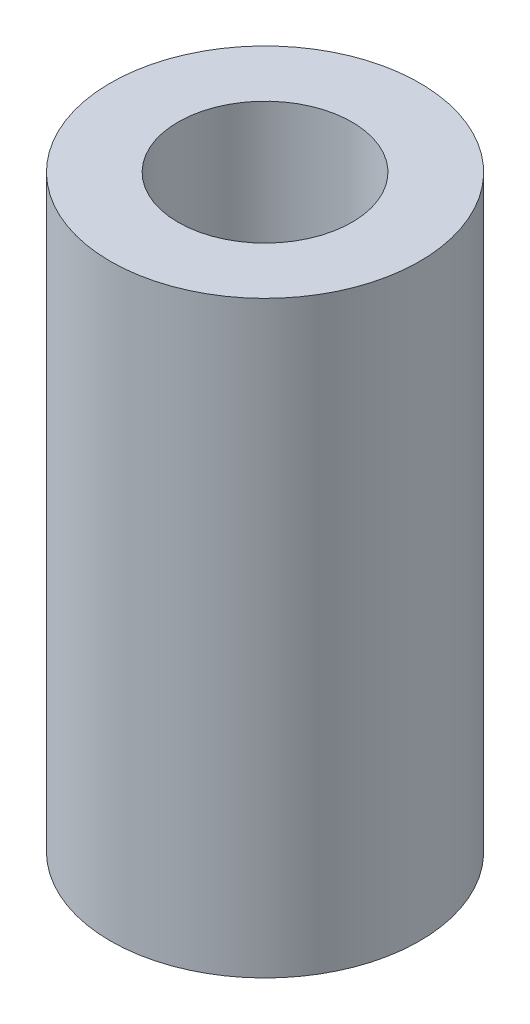
ISO-10303-21;
HEADER;
FILE_DESCRIPTION(('STEP AP214'),'2;1');
FILE_NAME('part.step','',(''),(''),'','','');
FILE_SCHEMA(('AUTOMOTIVE_DESIGN { 1 0 10303 214 1 1 1 1 }'));
ENDSEC;
DATA;
#1=APPLICATION_CONTEXT('core data for automotive mechanical design processes');
#2=APPLICATION_PROTOCOL_DEFINITION('international standard','automotive_design',2000,#1);
#3=PRODUCT_CONTEXT('',#1,'mechanical');
#4=PRODUCT('Part','Part','',(#3));
#5=PRODUCT_RELATED_PRODUCT_CATEGORY('part','',(#4));
#6=PRODUCT_DEFINITION_FORMATION('','',#4);
#7=PRODUCT_DEFINITION_CONTEXT('part definition',#1,'design');
#8=PRODUCT_DEFINITION('design','',#6,#7);
#9=PRODUCT_DEFINITION_SHAPE('','',#8);
#10=(LENGTH_UNIT() NAMED_UNIT(*) SI_UNIT(.MILLI.,.METRE.));
#11=(NAMED_UNIT(*) PLANE_ANGLE_UNIT() SI_UNIT($,.RADIAN.));
#12=(NAMED_UNIT(*) SI_UNIT($,.STERADIAN.) SOLID_ANGLE_UNIT());
#13=UNCERTAINTY_MEASURE_WITH_UNIT(LENGTH_MEASURE(1.E-05),#10,'distance_accuracy_value','');
#14=(GEOMETRIC_REPRESENTATION_CONTEXT(3) GLOBAL_UNCERTAINTY_ASSIGNED_CONTEXT((#13)) GLOBAL_UNIT_ASSIGNED_CONTEXT((#10,
#11,#12)) REPRESENTATION_CONTEXT('',''));
#15=CARTESIAN_POINT('',(0.,0.,0.));
#16=DIRECTION('',(0.,0.,1.));
#17=DIRECTION('',(1.,0.,0.));
#18=AXIS2_PLACEMENT_3D('',#15,#16,#17);
#19=CARTESIAN_POINT('',(0.,11.049,0.));
#20=DIRECTION('',(0.,1.,0.));
#21=DIRECTION('',(0.,0.,1.));
#22=AXIS2_PLACEMENT_3D('',#19,#20,#21);
#23=PLANE('',#22);
#24=CARTESIAN_POINT('',(0.,11.049,0.));
#25=DIRECTION('',(0.,1.,0.));
#26=DIRECTION('',(0.,0.,1.));
#27=AXIS2_PLACEMENT_3D('',#24,#25,#26);
#28=CIRCLE('',#27,2.90195);
#29=CARTESIAN_POINT('',(0.,11.049,2.90195));
#30=VERTEX_POINT('',#29);
#31=EDGE_CURVE('E10',#30,#30,#28,.T.);
#32=ORIENTED_EDGE('',*,*,#31,.T.);
#33=EDGE_LOOP('',(#32));
#34=FACE_BOUND('',#33,.T.);
#35=CARTESIAN_POINT('',(0.,11.049,0.));
#36=DIRECTION('',(0.,1.,0.));
#37=DIRECTION('',(0.,0.,1.));
#38=AXIS2_PLACEMENT_3D('',#35,#36,#37);
#39=CIRCLE('',#38,1.63195);
#40=CARTESIAN_POINT('',(0.,11.049,1.63195));
#41=VERTEX_POINT('',#40);
#42=EDGE_CURVE('E48',#41,#41,#39,.T.);
#43=ORIENTED_EDGE('',*,*,#42,.F.);
#44=EDGE_LOOP('',(#43));
#45=FACE_BOUND('',#44,.T.);
#46=ADVANCED_FACE('F37',(#34,#45),#23,.T.);
#47=CARTESIAN_POINT('',(0.,0.,0.));
#48=DIRECTION('',(0.,1.,0.));
#49=DIRECTION('',(0.,0.,1.));
#50=AXIS2_PLACEMENT_3D('',#47,#48,#49);
#51=PLANE('',#50);
#52=CARTESIAN_POINT('',(0.,0.,0.));
#53=DIRECTION('',(0.,1.,0.));
#54=DIRECTION('',(0.,0.,1.));
#55=AXIS2_PLACEMENT_3D('',#52,#53,#54);
#56=CIRCLE('',#55,2.90195);
#57=CARTESIAN_POINT('',(0.,0.,2.90195));
#58=VERTEX_POINT('',#57);
#59=EDGE_CURVE('E41',#58,#58,#56,.T.);
#60=ORIENTED_EDGE('',*,*,#59,.F.);
#61=EDGE_LOOP('',(#60));
#62=FACE_BOUND('',#61,.T.);
#63=CARTESIAN_POINT('',(0.,0.,0.));
#64=DIRECTION('',(0.,1.,0.));
#65=DIRECTION('',(0.,0.,1.));
#66=AXIS2_PLACEMENT_3D('',#63,#64,#65);
#67=CIRCLE('',#66,1.63195);
#68=CARTESIAN_POINT('',(0.,0.,1.63195));
#69=VERTEX_POINT('',#68);
#70=EDGE_CURVE('E50',#69,#69,#67,.T.);
#71=ORIENTED_EDGE('',*,*,#70,.T.);
#72=EDGE_LOOP('',(#71));
#73=FACE_BOUND('',#72,.T.);
#74=ADVANCED_FACE('F60',(#62,#73),#51,.F.);
#75=CARTESIAN_POINT('',(0.,11.049,0.));
#76=DIRECTION('',(0.,-1.,0.));
#77=DIRECTION('',(0.,0.,-1.));
#78=AXIS2_PLACEMENT_3D('',#75,#76,#77);
#79=CYLINDRICAL_SURFACE('',#78,2.90195);
#80=ORIENTED_EDGE('',*,*,#31,.F.);
#81=EDGE_LOOP('',(#80));
#82=FACE_BOUND('',#81,.T.);
#83=ORIENTED_EDGE('',*,*,#59,.T.);
#84=EDGE_LOOP('',(#83));
#85=FACE_BOUND('',#84,.T.);
#86=ADVANCED_FACE('F39',(#82,#85),#79,.T.);
#87=CARTESIAN_POINT('',(0.,11.049,0.));
#88=DIRECTION('',(0.,-1.,0.));
#89=DIRECTION('',(0.,0.,-1.));
#90=AXIS2_PLACEMENT_3D('',#87,#88,#89);
#91=CYLINDRICAL_SURFACE('',#90,1.63195);
#92=ORIENTED_EDGE('',*,*,#42,.T.);
#93=EDGE_LOOP('',(#92));
#94=FACE_BOUND('',#93,.T.);
#95=ORIENTED_EDGE('',*,*,#70,.F.);
#96=EDGE_LOOP('',(#95));
#97=FACE_BOUND('',#96,.T.);
#98=ADVANCED_FACE('F56',(#94,#97),#91,.F.);
#99=CLOSED_SHELL('',(#46,#74,#86,#98));
#100=MANIFOLD_SOLID_BREP('B2',#99);
#101=ADVANCED_BREP_SHAPE_REPRESENTATION('',(#18,#100),#14);
#102=SHAPE_DEFINITION_REPRESENTATION(#9,#101);
ENDSEC;
END-ISO-10303-21;
